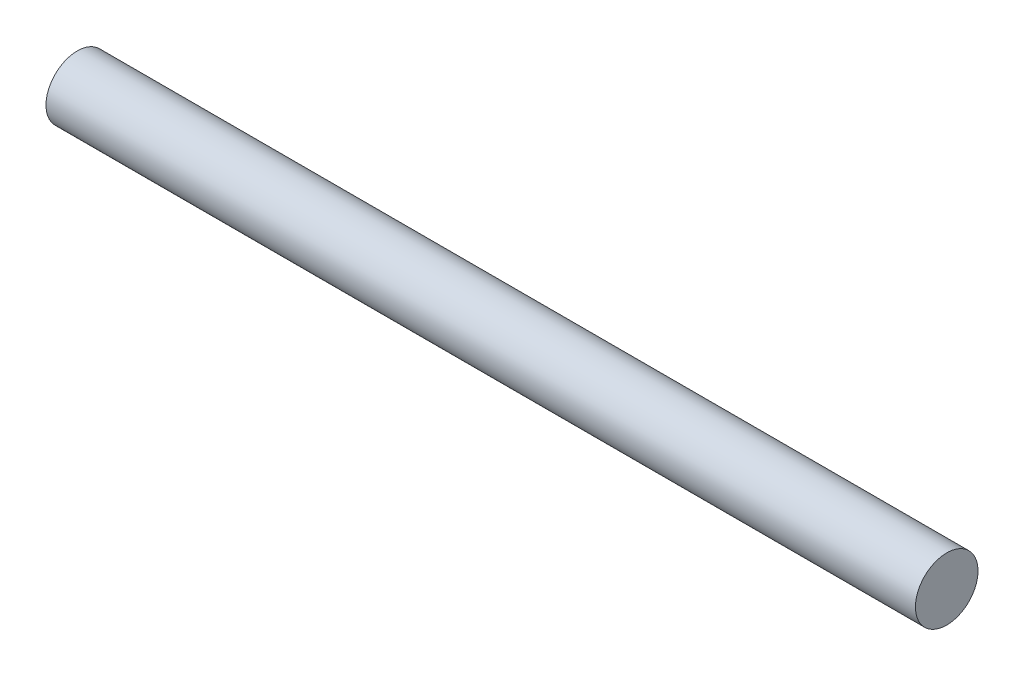
ISO-10303-21;
HEADER;
FILE_DESCRIPTION(('STEP AP214'),'2;1');
FILE_NAME('part.step','',(''),(''),'','','');
FILE_SCHEMA(('AUTOMOTIVE_DESIGN { 1 0 10303 214 1 1 1 1 }'));
ENDSEC;
DATA;
#1=APPLICATION_CONTEXT('core data for automotive mechanical design processes');
#2=APPLICATION_PROTOCOL_DEFINITION('international standard','automotive_design',2000,#1);
#3=PRODUCT_CONTEXT('',#1,'mechanical');
#4=PRODUCT('Part','Part','',(#3));
#5=PRODUCT_RELATED_PRODUCT_CATEGORY('part','',(#4));
#6=PRODUCT_DEFINITION_FORMATION('','',#4);
#7=PRODUCT_DEFINITION_CONTEXT('part definition',#1,'design');
#8=PRODUCT_DEFINITION('design','',#6,#7);
#9=PRODUCT_DEFINITION_SHAPE('','',#8);
#10=(LENGTH_UNIT() NAMED_UNIT(*) SI_UNIT(.MILLI.,.METRE.));
#11=(NAMED_UNIT(*) PLANE_ANGLE_UNIT() SI_UNIT($,.RADIAN.));
#12=(NAMED_UNIT(*) SI_UNIT($,.STERADIAN.) SOLID_ANGLE_UNIT());
#13=UNCERTAINTY_MEASURE_WITH_UNIT(LENGTH_MEASURE(1.E-05),#10,'distance_accuracy_value','');
#14=(GEOMETRIC_REPRESENTATION_CONTEXT(3) GLOBAL_UNCERTAINTY_ASSIGNED_CONTEXT((#13)) GLOBAL_UNIT_ASSIGNED_CONTEXT((#10,
#11,#12)) REPRESENTATION_CONTEXT('',''));
#15=CARTESIAN_POINT('',(0.,0.,0.));
#16=DIRECTION('',(0.,0.,1.));
#17=DIRECTION('',(1.,0.,0.));
#18=AXIS2_PLACEMENT_3D('',#15,#16,#17);
#19=CARTESIAN_POINT('',(-250.,0.,0.));
#20=DIRECTION('',(1.,0.,0.));
#21=DIRECTION('',(0.,1.,0.));
#22=AXIS2_PLACEMENT_3D('',#19,#20,#21);
#23=PLANE('',#22);
#24=CARTESIAN_POINT('',(-250.,0.,0.));
#25=DIRECTION('',(-1.,0.,0.));
#26=DIRECTION('',(0.,-1.,0.));
#27=AXIS2_PLACEMENT_3D('',#24,#25,#26);
#28=CIRCLE('',#27,18.);
#29=CARTESIAN_POINT('',(-250.,-18.,0.));
#30=VERTEX_POINT('',#29);
#31=EDGE_CURVE('E10',#30,#30,#28,.T.);
#32=ORIENTED_EDGE('',*,*,#31,.T.);
#33=EDGE_LOOP('',(#32));
#34=FACE_BOUND('',#33,.T.);
#35=ADVANCED_FACE('F36',(#34),#23,.F.);
#36=CARTESIAN_POINT('',(-250.,0.,0.));
#37=DIRECTION('',(-1.,0.,0.));
#38=DIRECTION('',(0.,-1.,0.));
#39=AXIS2_PLACEMENT_3D('',#36,#37,#38);
#40=CYLINDRICAL_SURFACE('',#39,18.);
#41=ORIENTED_EDGE('',*,*,#31,.F.);
#42=EDGE_LOOP('',(#41));
#43=FACE_BOUND('',#42,.T.);
#44=CARTESIAN_POINT('',(250.,0.,0.));
#45=DIRECTION('',(-1.,0.,0.));
#46=DIRECTION('',(0.,-1.,0.));
#47=AXIS2_PLACEMENT_3D('',#44,#45,#46);
#48=CIRCLE('',#47,18.);
#49=CARTESIAN_POINT('',(250.,-17.9999999999999,0.));
#50=VERTEX_POINT('',#49);
#51=EDGE_CURVE('E42',#50,#50,#48,.T.);
#52=ORIENTED_EDGE('',*,*,#51,.T.);
#53=EDGE_LOOP('',(#52));
#54=FACE_BOUND('',#53,.T.);
#55=ADVANCED_FACE('F48',(#43,#54),#40,.T.);
#56=CARTESIAN_POINT('',(250.,18.0000000000001,0.));
#57=DIRECTION('',(-1.,0.,0.));
#58=DIRECTION('',(0.,-1.,0.));
#59=AXIS2_PLACEMENT_3D('',#56,#57,#58);
#60=PLANE('',#59);
#61=ORIENTED_EDGE('',*,*,#51,.F.);
#62=EDGE_LOOP('',(#61));
#63=FACE_BOUND('',#62,.T.);
#64=ADVANCED_FACE('F50',(#63),#60,.F.);
#65=CLOSED_SHELL('',(#35,#55,#64));
#66=MANIFOLD_SOLID_BREP('B2',#65);
#67=ADVANCED_BREP_SHAPE_REPRESENTATION('',(#18,#66),#14);
#68=SHAPE_DEFINITION_REPRESENTATION(#9,#67);
ENDSEC;
END-ISO-10303-21;
